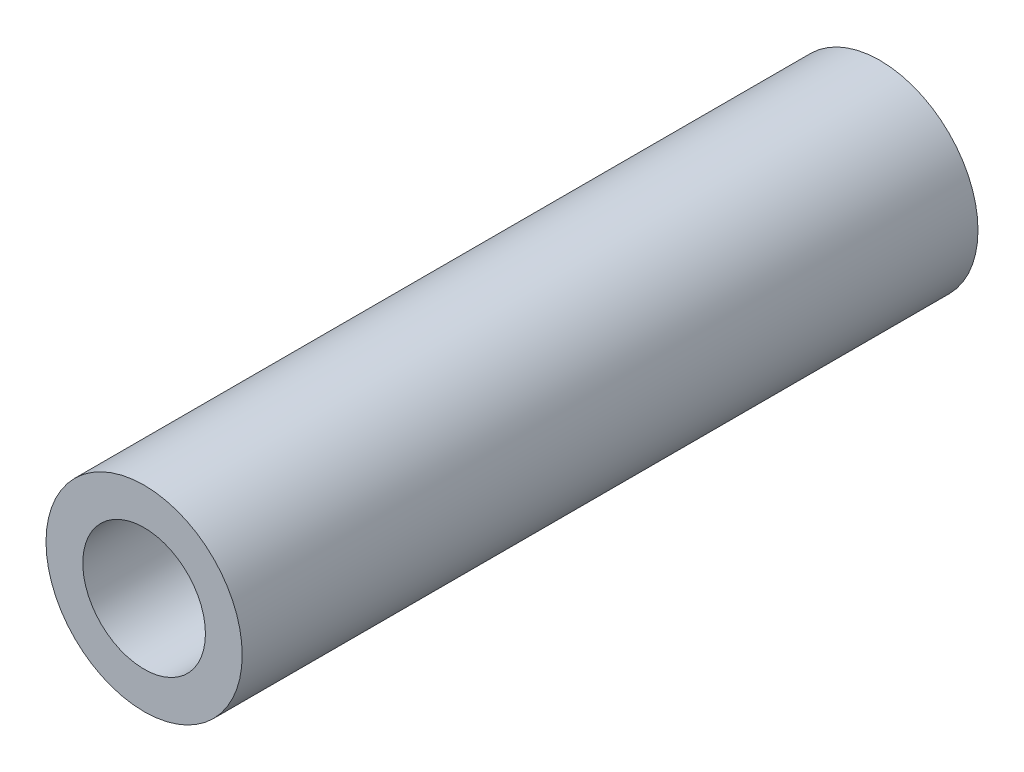
ISO-10303-21;
HEADER;
FILE_DESCRIPTION(('STEP AP214'),'2;1');
FILE_NAME('part.step','',(''),(''),'','','');
FILE_SCHEMA(('AUTOMOTIVE_DESIGN { 1 0 10303 214 1 1 1 1 }'));
ENDSEC;
DATA;
#1=APPLICATION_CONTEXT('core data for automotive mechanical design processes');
#2=APPLICATION_PROTOCOL_DEFINITION('international standard','automotive_design',2000,#1);
#3=PRODUCT_CONTEXT('',#1,'mechanical');
#4=PRODUCT('Part','Part','',(#3));
#5=PRODUCT_RELATED_PRODUCT_CATEGORY('part','',(#4));
#6=PRODUCT_DEFINITION_FORMATION('','',#4);
#7=PRODUCT_DEFINITION_CONTEXT('part definition',#1,'design');
#8=PRODUCT_DEFINITION('design','',#6,#7);
#9=PRODUCT_DEFINITION_SHAPE('','',#8);
#10=(LENGTH_UNIT() NAMED_UNIT(*) SI_UNIT(.MILLI.,.METRE.));
#11=(NAMED_UNIT(*) PLANE_ANGLE_UNIT() SI_UNIT($,.RADIAN.));
#12=(NAMED_UNIT(*) SI_UNIT($,.STERADIAN.) SOLID_ANGLE_UNIT());
#13=UNCERTAINTY_MEASURE_WITH_UNIT(LENGTH_MEASURE(1.E-05),#10,'distance_accuracy_value','');
#14=(GEOMETRIC_REPRESENTATION_CONTEXT(3) GLOBAL_UNCERTAINTY_ASSIGNED_CONTEXT((#13)) GLOBAL_UNIT_ASSIGNED_CONTEXT((#10,
#11,#12)) REPRESENTATION_CONTEXT('',''));
#15=CARTESIAN_POINT('',(0.,0.,0.));
#16=DIRECTION('',(0.,0.,1.));
#17=DIRECTION('',(1.,0.,0.));
#18=AXIS2_PLACEMENT_3D('',#15,#16,#17);
#19=CARTESIAN_POINT('',(0.,0.,30.));
#20=DIRECTION('',(0.,0.,1.));
#21=DIRECTION('',(1.,0.,0.));
#22=AXIS2_PLACEMENT_3D('',#19,#20,#21);
#23=PLANE('',#22);
#24=CARTESIAN_POINT('',(0.,0.,30.));
#25=DIRECTION('',(0.,0.,1.));
#26=DIRECTION('',(1.,0.,0.));
#27=AXIS2_PLACEMENT_3D('',#24,#25,#26);
#28=CIRCLE('',#27,4.);
#29=CARTESIAN_POINT('',(4.,0.,30.));
#30=VERTEX_POINT('',#29);
#31=EDGE_CURVE('E10',#30,#30,#28,.T.);
#32=ORIENTED_EDGE('',*,*,#31,.T.);
#33=EDGE_LOOP('',(#32));
#34=FACE_BOUND('',#33,.T.);
#35=CARTESIAN_POINT('',(0.,0.,30.));
#36=DIRECTION('',(0.,0.,1.));
#37=DIRECTION('',(1.,0.,0.));
#38=AXIS2_PLACEMENT_3D('',#35,#36,#37);
#39=CIRCLE('',#38,2.5);
#40=CARTESIAN_POINT('',(2.5,0.,30.));
#41=VERTEX_POINT('',#40);
#42=EDGE_CURVE('E50',#41,#41,#39,.T.);
#43=ORIENTED_EDGE('',*,*,#42,.F.);
#44=EDGE_LOOP('',(#43));
#45=FACE_BOUND('',#44,.T.);
#46=ADVANCED_FACE('F38',(#34,#45),#23,.T.);
#47=CARTESIAN_POINT('',(0.,0.,0.));
#48=DIRECTION('',(0.,0.,1.));
#49=DIRECTION('',(1.,0.,0.));
#50=AXIS2_PLACEMENT_3D('',#47,#48,#49);
#51=PLANE('',#50);
#52=CARTESIAN_POINT('',(0.,0.,0.));
#53=DIRECTION('',(0.,0.,1.));
#54=DIRECTION('',(1.,0.,0.));
#55=AXIS2_PLACEMENT_3D('',#52,#53,#54);
#56=CIRCLE('',#55,4.);
#57=CARTESIAN_POINT('',(4.,0.,0.));
#58=VERTEX_POINT('',#57);
#59=EDGE_CURVE('E42',#58,#58,#56,.T.);
#60=ORIENTED_EDGE('',*,*,#59,.F.);
#61=EDGE_LOOP('',(#60));
#62=FACE_BOUND('',#61,.T.);
#63=CARTESIAN_POINT('',(0.,0.,0.));
#64=DIRECTION('',(0.,0.,1.));
#65=DIRECTION('',(1.,0.,0.));
#66=AXIS2_PLACEMENT_3D('',#63,#64,#65);
#67=CIRCLE('',#66,2.5);
#68=CARTESIAN_POINT('',(2.5,0.,0.));
#69=VERTEX_POINT('',#68);
#70=EDGE_CURVE('E52',#69,#69,#67,.T.);
#71=ORIENTED_EDGE('',*,*,#70,.T.);
#72=EDGE_LOOP('',(#71));
#73=FACE_BOUND('',#72,.T.);
#74=ADVANCED_FACE('F63',(#62,#73),#51,.F.);
#75=CARTESIAN_POINT('',(0.,0.,30.));
#76=DIRECTION('',(0.,0.,-1.));
#77=DIRECTION('',(-1.,0.,0.));
#78=AXIS2_PLACEMENT_3D('',#75,#76,#77);
#79=CYLINDRICAL_SURFACE('',#78,4.);
#80=ORIENTED_EDGE('',*,*,#31,.F.);
#81=EDGE_LOOP('',(#80));
#82=FACE_BOUND('',#81,.T.);
#83=ORIENTED_EDGE('',*,*,#59,.T.);
#84=EDGE_LOOP('',(#83));
#85=FACE_BOUND('',#84,.T.);
#86=ADVANCED_FACE('F40',(#82,#85),#79,.T.);
#87=CARTESIAN_POINT('',(0.,0.,30.));
#88=DIRECTION('',(0.,0.,-1.));
#89=DIRECTION('',(-1.,0.,0.));
#90=AXIS2_PLACEMENT_3D('',#87,#88,#89);
#91=CYLINDRICAL_SURFACE('',#90,2.5);
#92=ORIENTED_EDGE('',*,*,#42,.T.);
#93=EDGE_LOOP('',(#92));
#94=FACE_BOUND('',#93,.T.);
#95=ORIENTED_EDGE('',*,*,#70,.F.);
#96=EDGE_LOOP('',(#95));
#97=FACE_BOUND('',#96,.T.);
#98=ADVANCED_FACE('F59',(#94,#97),#91,.F.);
#99=CLOSED_SHELL('',(#46,#74,#86,#98));
#100=MANIFOLD_SOLID_BREP('B2',#99);
#101=ADVANCED_BREP_SHAPE_REPRESENTATION('',(#18,#100),#14);
#102=SHAPE_DEFINITION_REPRESENTATION(#9,#101);
ENDSEC;
END-ISO-10303-21;
